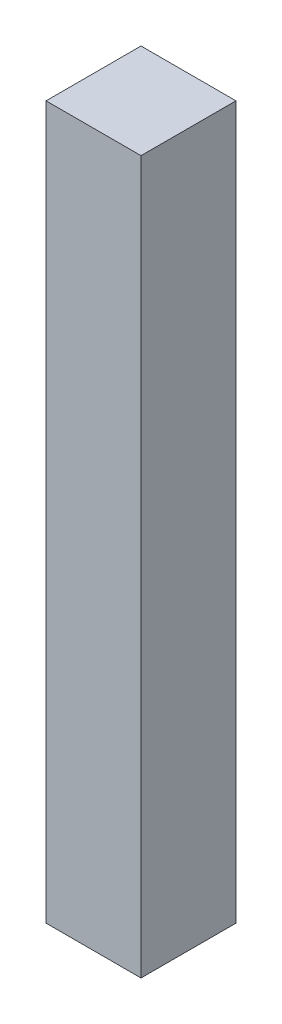
ISO-10303-21;
HEADER;
FILE_DESCRIPTION(('STEP AP214'),'2;1');
FILE_NAME('part.step','',(''),(''),'','','');
FILE_SCHEMA(('AUTOMOTIVE_DESIGN { 1 0 10303 214 1 1 1 1 }'));
ENDSEC;
DATA;
#1=APPLICATION_CONTEXT('core data for automotive mechanical design processes');
#2=APPLICATION_PROTOCOL_DEFINITION('international standard','automotive_design',2000,#1);
#3=PRODUCT_CONTEXT('',#1,'mechanical');
#4=PRODUCT('Part','Part','',(#3));
#5=PRODUCT_RELATED_PRODUCT_CATEGORY('part','',(#4));
#6=PRODUCT_DEFINITION_FORMATION('','',#4);
#7=PRODUCT_DEFINITION_CONTEXT('part definition',#1,'design');
#8=PRODUCT_DEFINITION('design','',#6,#7);
#9=PRODUCT_DEFINITION_SHAPE('','',#8);
#10=(LENGTH_UNIT() NAMED_UNIT(*) SI_UNIT(.MILLI.,.METRE.));
#11=(NAMED_UNIT(*) PLANE_ANGLE_UNIT() SI_UNIT($,.RADIAN.));
#12=(NAMED_UNIT(*) SI_UNIT($,.STERADIAN.) SOLID_ANGLE_UNIT());
#13=UNCERTAINTY_MEASURE_WITH_UNIT(LENGTH_MEASURE(1.E-05),#10,'distance_accuracy_value','');
#14=(GEOMETRIC_REPRESENTATION_CONTEXT(3) GLOBAL_UNCERTAINTY_ASSIGNED_CONTEXT((#13)) GLOBAL_UNIT_ASSIGNED_CONTEXT((#10,
#11,#12)) REPRESENTATION_CONTEXT('',''));
#15=CARTESIAN_POINT('',(0.,0.,0.));
#16=DIRECTION('',(0.,0.,1.));
#17=DIRECTION('',(1.,0.,0.));
#18=AXIS2_PLACEMENT_3D('',#15,#16,#17);
#19=CARTESIAN_POINT('',(0.,0.,5.08));
#20=DIRECTION('',(1.,0.,0.));
#21=DIRECTION('',(0.,0.,-1.));
#22=AXIS2_PLACEMENT_3D('',#19,#20,#21);
#23=PLANE('',#22);
#24=DIRECTION('',(0.,-1.,0.));
#25=VECTOR('',#24,1.);
#26=CARTESIAN_POINT('',(0.,0.,0.));
#27=LINE('',#26,#25);
#28=CARTESIAN_POINT('',(0.,38.1,0.));
#29=VERTEX_POINT('',#28);
#30=CARTESIAN_POINT('',(0.,0.,0.));
#31=VERTEX_POINT('',#30);
#32=EDGE_CURVE('E96',#29,#31,#27,.T.);
#33=ORIENTED_EDGE('',*,*,#32,.T.);
#34=DIRECTION('',(0.,0.,-1.));
#35=VECTOR('',#34,1.);
#36=CARTESIAN_POINT('',(0.,0.,5.08));
#37=LINE('',#36,#35);
#38=CARTESIAN_POINT('',(0.,0.,5.08));
#39=VERTEX_POINT('',#38);
#40=EDGE_CURVE('E11',#39,#31,#37,.T.);
#41=ORIENTED_EDGE('',*,*,#40,.F.);
#42=DIRECTION('',(0.,-1.,0.));
#43=VECTOR('',#42,1.);
#44=CARTESIAN_POINT('',(0.,0.,5.08));
#45=LINE('',#44,#43);
#46=CARTESIAN_POINT('',(0.,38.1,5.08));
#47=VERTEX_POINT('',#46);
#48=EDGE_CURVE('E84',#47,#39,#45,.T.);
#49=ORIENTED_EDGE('',*,*,#48,.F.);
#50=DIRECTION('',(0.,0.,-1.));
#51=VECTOR('',#50,1.);
#52=CARTESIAN_POINT('',(0.,38.1,5.08));
#53=LINE('',#52,#51);
#54=EDGE_CURVE('E92',#47,#29,#53,.T.);
#55=ORIENTED_EDGE('',*,*,#54,.T.);
#56=EDGE_LOOP('',(#33,#41,#49,#55));
#57=FACE_BOUND('',#56,.T.);
#58=ADVANCED_FACE('F33',(#57),#23,.F.);
#59=CARTESIAN_POINT('',(0.,0.,5.08));
#60=DIRECTION('',(0.,1.,0.));
#61=DIRECTION('',(0.,0.,1.));
#62=AXIS2_PLACEMENT_3D('',#59,#60,#61);
#63=PLANE('',#62);
#64=DIRECTION('',(1.,0.,0.));
#65=VECTOR('',#64,1.);
#66=CARTESIAN_POINT('',(0.,0.,0.));
#67=LINE('',#66,#65);
#68=CARTESIAN_POINT('',(5.08,0.,0.));
#69=VERTEX_POINT('',#68);
#70=EDGE_CURVE('E88',#31,#69,#67,.T.);
#71=ORIENTED_EDGE('',*,*,#70,.T.);
#72=DIRECTION('',(0.,0.,-1.));
#73=VECTOR('',#72,1.);
#74=CARTESIAN_POINT('',(5.08,0.,5.08));
#75=LINE('',#74,#73);
#76=CARTESIAN_POINT('',(5.08,0.,5.08));
#77=VERTEX_POINT('',#76);
#78=EDGE_CURVE('E41',#77,#69,#75,.T.);
#79=ORIENTED_EDGE('',*,*,#78,.F.);
#80=DIRECTION('',(1.,0.,0.));
#81=VECTOR('',#80,1.);
#82=CARTESIAN_POINT('',(0.,0.,5.08));
#83=LINE('',#82,#81);
#84=EDGE_CURVE('E79',#39,#77,#83,.T.);
#85=ORIENTED_EDGE('',*,*,#84,.F.);
#86=ORIENTED_EDGE('',*,*,#40,.T.);
#87=EDGE_LOOP('',(#71,#79,#85,#86));
#88=FACE_BOUND('',#87,.T.);
#89=ADVANCED_FACE('F87',(#88),#63,.F.);
#90=CARTESIAN_POINT('',(5.08,0.,5.08));
#91=DIRECTION('',(-1.,0.,0.));
#92=DIRECTION('',(0.,0.,1.));
#93=AXIS2_PLACEMENT_3D('',#90,#91,#92);
#94=PLANE('',#93);
#95=DIRECTION('',(0.,1.,0.));
#96=VECTOR('',#95,1.);
#97=CARTESIAN_POINT('',(5.08,0.,0.));
#98=LINE('',#97,#96);
#99=CARTESIAN_POINT('',(5.08,38.1,0.));
#100=VERTEX_POINT('',#99);
#101=EDGE_CURVE('E66',#69,#100,#98,.T.);
#102=ORIENTED_EDGE('',*,*,#101,.T.);
#103=DIRECTION('',(0.,0.,-1.));
#104=VECTOR('',#103,1.);
#105=CARTESIAN_POINT('',(5.08,38.1,5.08));
#106=LINE('',#105,#104);
#107=CARTESIAN_POINT('',(5.08,38.1,5.08));
#108=VERTEX_POINT('',#107);
#109=EDGE_CURVE('E89',#108,#100,#106,.T.);
#110=ORIENTED_EDGE('',*,*,#109,.F.);
#111=DIRECTION('',(0.,1.,0.));
#112=VECTOR('',#111,1.);
#113=CARTESIAN_POINT('',(5.08,0.,5.08));
#114=LINE('',#113,#112);
#115=EDGE_CURVE('E82',#77,#108,#114,.T.);
#116=ORIENTED_EDGE('',*,*,#115,.F.);
#117=ORIENTED_EDGE('',*,*,#78,.T.);
#118=EDGE_LOOP('',(#102,#110,#116,#117));
#119=FACE_BOUND('',#118,.T.);
#120=ADVANCED_FACE('F90',(#119),#94,.F.);
#121=CARTESIAN_POINT('',(0.,38.1,5.08));
#122=DIRECTION('',(0.,-1.,0.));
#123=DIRECTION('',(0.,0.,-1.));
#124=AXIS2_PLACEMENT_3D('',#121,#122,#123);
#125=PLANE('',#124);
#126=DIRECTION('',(-1.,0.,0.));
#127=VECTOR('',#126,1.);
#128=CARTESIAN_POINT('',(0.,38.1,0.));
#129=LINE('',#128,#127);
#130=EDGE_CURVE('E72',#100,#29,#129,.T.);
#131=ORIENTED_EDGE('',*,*,#130,.T.);
#132=ORIENTED_EDGE('',*,*,#54,.F.);
#133=DIRECTION('',(-1.,0.,0.));
#134=VECTOR('',#133,1.);
#135=CARTESIAN_POINT('',(0.,38.1,5.08));
#136=LINE('',#135,#134);
#137=EDGE_CURVE('E49',#108,#47,#136,.T.);
#138=ORIENTED_EDGE('',*,*,#137,.F.);
#139=ORIENTED_EDGE('',*,*,#109,.T.);
#140=EDGE_LOOP('',(#131,#132,#138,#139));
#141=FACE_BOUND('',#140,.T.);
#142=ADVANCED_FACE('F103',(#141),#125,.F.);
#143=CARTESIAN_POINT('',(0.,0.,5.08));
#144=DIRECTION('',(0.,0.,-1.));
#145=DIRECTION('',(-1.,0.,0.));
#146=AXIS2_PLACEMENT_3D('',#143,#144,#145);
#147=PLANE('',#146);
#148=ORIENTED_EDGE('',*,*,#48,.T.);
#149=ORIENTED_EDGE('',*,*,#84,.T.);
#150=ORIENTED_EDGE('',*,*,#115,.T.);
#151=ORIENTED_EDGE('',*,*,#137,.T.);
#152=EDGE_LOOP('',(#148,#149,#150,#151));
#153=FACE_BOUND('',#152,.T.);
#154=ADVANCED_FACE('F80',(#153),#147,.F.);
#155=CARTESIAN_POINT('',(0.,0.,0.));
#156=DIRECTION('',(0.,0.,-1.));
#157=DIRECTION('',(-1.,0.,0.));
#158=AXIS2_PLACEMENT_3D('',#155,#156,#157);
#159=PLANE('',#158);
#160=ORIENTED_EDGE('',*,*,#32,.F.);
#161=ORIENTED_EDGE('',*,*,#130,.F.);
#162=ORIENTED_EDGE('',*,*,#101,.F.);
#163=ORIENTED_EDGE('',*,*,#70,.F.);
#164=EDGE_LOOP('',(#160,#161,#162,#163));
#165=FACE_BOUND('',#164,.T.);
#166=ADVANCED_FACE('F106',(#165),#159,.T.);
#167=CLOSED_SHELL('',(#58,#89,#120,#142,#154,#166));
#168=MANIFOLD_SOLID_BREP('B2',#167);
#169=ADVANCED_BREP_SHAPE_REPRESENTATION('',(#18,#168),#14);
#170=SHAPE_DEFINITION_REPRESENTATION(#9,#169);
ENDSEC;
END-ISO-10303-21;
